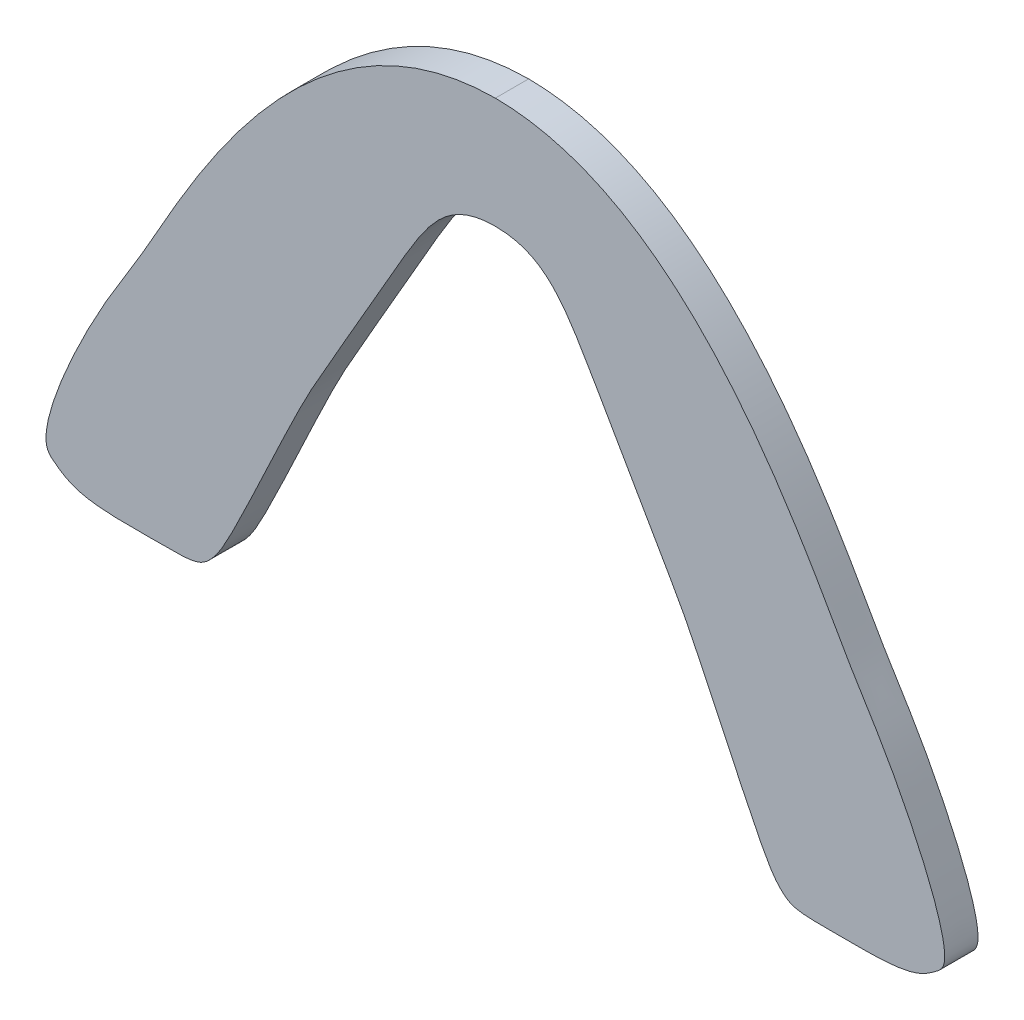
ISO-10303-21;
HEADER;
FILE_DESCRIPTION(('STEP AP214'),'2;1');
FILE_NAME('part.step','',(''),(''),'','','');
FILE_SCHEMA(('AUTOMOTIVE_DESIGN { 1 0 10303 214 1 1 1 1 }'));
ENDSEC;
DATA;
#1=APPLICATION_CONTEXT('core data for automotive mechanical design processes');
#2=APPLICATION_PROTOCOL_DEFINITION('international standard','automotive_design',2000,#1);
#3=PRODUCT_CONTEXT('',#1,'mechanical');
#4=PRODUCT('Part','Part','',(#3));
#5=PRODUCT_RELATED_PRODUCT_CATEGORY('part','',(#4));
#6=PRODUCT_DEFINITION_FORMATION('','',#4);
#7=PRODUCT_DEFINITION_CONTEXT('part definition',#1,'design');
#8=PRODUCT_DEFINITION('design','',#6,#7);
#9=PRODUCT_DEFINITION_SHAPE('','',#8);
#10=(LENGTH_UNIT() NAMED_UNIT(*) SI_UNIT(.MILLI.,.METRE.));
#11=(NAMED_UNIT(*) PLANE_ANGLE_UNIT() SI_UNIT($,.RADIAN.));
#12=(NAMED_UNIT(*) SI_UNIT($,.STERADIAN.) SOLID_ANGLE_UNIT());
#13=UNCERTAINTY_MEASURE_WITH_UNIT(LENGTH_MEASURE(1.E-05),#10,'distance_accuracy_value','');
#14=(GEOMETRIC_REPRESENTATION_CONTEXT(3) GLOBAL_UNCERTAINTY_ASSIGNED_CONTEXT((#13)) GLOBAL_UNIT_ASSIGNED_CONTEXT((#10,
#11,#12)) REPRESENTATION_CONTEXT('',''));
#15=CARTESIAN_POINT('',(0.,0.,0.));
#16=DIRECTION('',(0.,0.,1.));
#17=DIRECTION('',(1.,0.,0.));
#18=AXIS2_PLACEMENT_3D('',#15,#16,#17);
#19=CARTESIAN_POINT('',(0.,30.,3.));
#20=CARTESIAN_POINT('',(-17.1942796454037,29.8874058416594,3.));
#21=CARTESIAN_POINT('',(-29.7257343106107,4.93805107902933,3.));
#22=CARTESIAN_POINT('',(-36.7381908989796,-5.69481323643311,3.));
#23=CARTESIAN_POINT('',(-41.7627249954742,-16.7141084568017,3.));
#24=CARTESIAN_POINT('',(-38.863004845609,-18.8759356772714,3.));
#25=CARTESIAN_POINT('',(-37.4244214350834,-19.856755260774,3.));
#26=CARTESIAN_POINT('',(-27.4189705711391,-19.7967117454138,3.));
#27=CARTESIAN_POINT('',(-26.4894303641271,-19.9390606672589,3.));
#28=CARTESIAN_POINT('',(-23.8176964979451,-16.5294006272602,3.));
#29=CARTESIAN_POINT('',(-18.2793744848231,-3.97143499974837,3.));
#30=CARTESIAN_POINT('',(-15.4138890798223,1.02061960027083,3.));
#31=CARTESIAN_POINT('',(-7.75596279354349,14.4395052448767,3.));
#32=CARTESIAN_POINT('',(-4.38376498207084,20.,3.));
#33=CARTESIAN_POINT('',(0.,20.,3.));
#34=B_SPLINE_CURVE_WITH_KNOTS('',3,(#19,#20,#21,#22,#23,#24,#25,#26,#27,#28,#29,#30,#31,#32,
#33),.UNSPECIFIED.,.F.,.F.,(4,1,1,1,1,1,1,1,1,1,1,1,4),(0.303894497040815,0.38478301417555,
0.404441064065432,0.489804559064722,0.508040858092365,0.56856775531422,0.585333686944483,
0.65893424276473,0.676015716108626,0.739066947039544,0.749871457977586,0.776179421622678,
0.803894497039859),.UNSPECIFIED.);
#35=DIRECTION('',(0.,0.,-1.));
#36=VECTOR('',#35,1.);
#37=SURFACE_OF_LINEAR_EXTRUSION('',#34,#36);
#38=CARTESIAN_POINT('',(0.,30.,0.));
#39=CARTESIAN_POINT('',(-17.1942796454037,29.8874058416594,0.));
#40=CARTESIAN_POINT('',(-29.7257343106107,4.93805107902933,0.));
#41=CARTESIAN_POINT('',(-36.7381908989796,-5.69481323643311,0.));
#42=CARTESIAN_POINT('',(-41.7627249954742,-16.7141084568017,0.));
#43=CARTESIAN_POINT('',(-38.863004845609,-18.8759356772714,0.));
#44=CARTESIAN_POINT('',(-37.4244214350834,-19.856755260774,0.));
#45=CARTESIAN_POINT('',(-27.4189705711391,-19.7967117454138,0.));
#46=CARTESIAN_POINT('',(-26.4894303641271,-19.9390606672589,0.));
#47=CARTESIAN_POINT('',(-23.8176964979451,-16.5294006272602,0.));
#48=CARTESIAN_POINT('',(-18.2793744848231,-3.97143499974837,0.));
#49=CARTESIAN_POINT('',(-15.4138890798223,1.02061960027083,0.));
#50=CARTESIAN_POINT('',(-7.75596279354349,14.4395052448767,0.));
#51=CARTESIAN_POINT('',(-4.38376498207084,20.,0.));
#52=CARTESIAN_POINT('',(0.,20.,0.));
#53=B_SPLINE_CURVE_WITH_KNOTS('',3,(#38,#39,#40,#41,#42,#43,#44,#45,#46,#47,#48,#49,#50,#51,
#52),.UNSPECIFIED.,.F.,.F.,(4,1,1,1,1,1,1,1,1,1,1,1,4),(0.303894497040815,0.38478301417555,
0.404441064065432,0.489804559064722,0.508040858092365,0.56856775531422,0.585333686944483,
0.65893424276473,0.676015716108626,0.739066947039544,0.749871457977586,0.776179421622678,
0.803894497039859),.UNSPECIFIED.);
#54=CARTESIAN_POINT('',(0.,30.,0.));
#55=VERTEX_POINT('',#54);
#56=CARTESIAN_POINT('',(0.,20.,0.));
#57=VERTEX_POINT('',#56);
#58=EDGE_CURVE('E73',#55,#57,#53,.T.);
#59=ORIENTED_EDGE('',*,*,#58,.T.);
#60=DIRECTION('',(0.,0.,-1.));
#61=VECTOR('',#60,1.);
#62=CARTESIAN_POINT('',(0.,20.,3.));
#63=LINE('',#62,#61);
#64=CARTESIAN_POINT('',(0.,20.,3.));
#65=VERTEX_POINT('',#64);
#66=EDGE_CURVE('E11',#65,#57,#63,.T.);
#67=ORIENTED_EDGE('',*,*,#66,.F.);
#68=CARTESIAN_POINT('',(0.,30.,3.));
#69=VERTEX_POINT('',#68);
#70=EDGE_CURVE('E72',#69,#65,#34,.T.);
#71=ORIENTED_EDGE('',*,*,#70,.F.);
#72=DIRECTION('',(0.,0.,-1.));
#73=VECTOR('',#72,1.);
#74=CARTESIAN_POINT('',(0.,30.,3.));
#75=LINE('',#74,#73);
#76=EDGE_CURVE('E49',#69,#55,#75,.T.);
#77=ORIENTED_EDGE('',*,*,#76,.T.);
#78=EDGE_LOOP('',(#59,#67,#71,#77));
#79=FACE_BOUND('',#78,.T.);
#80=ADVANCED_FACE('F39',(#79),#37,.F.);
#81=CARTESIAN_POINT('',(0.,20.,3.));
#82=CARTESIAN_POINT('',(4.38376498207084,20.,3.));
#83=CARTESIAN_POINT('',(7.75596279354348,14.4395052448767,3.));
#84=CARTESIAN_POINT('',(15.4138890798223,1.02061960027083,3.));
#85=CARTESIAN_POINT('',(18.279374484823,-3.97143499974837,3.));
#86=CARTESIAN_POINT('',(23.8176964979451,-16.5294006272602,3.));
#87=CARTESIAN_POINT('',(26.489430364127,-19.9390606672589,3.));
#88=CARTESIAN_POINT('',(27.4189705711391,-19.7967117454138,3.));
#89=CARTESIAN_POINT('',(37.4244214350834,-19.856755260774,3.));
#90=CARTESIAN_POINT('',(38.863004845609,-18.8759356772714,3.));
#91=CARTESIAN_POINT('',(41.7627249954742,-16.7141084568016,3.));
#92=CARTESIAN_POINT('',(36.7381908989797,-5.6948132364331,3.));
#93=CARTESIAN_POINT('',(29.7257343106106,4.93805107902933,3.));
#94=CARTESIAN_POINT('',(17.1942796454037,29.8874058416594,3.));
#95=CARTESIAN_POINT('',(0.,30.,3.));
#96=B_SPLINE_CURVE_WITH_KNOTS('',3,(#81,#82,#83,#84,#85,#86,#87,#88,#89,#90,#91,#92,#93,#94,
#95),.UNSPECIFIED.,.F.,.F.,(4,1,1,1,1,1,1,1,1,1,1,1,4),(0.303894497040815,0.331609572457996,
0.357917536103088,0.36872204704113,0.431773277972048,0.448854751315944,0.522455307136192,
0.539221238766454,0.599748135988309,0.617984435015952,0.703347930015242,0.723005979905124,
0.803894497039859),.UNSPECIFIED.);
#97=DIRECTION('',(0.,0.,-1.));
#98=VECTOR('',#97,1.);
#99=SURFACE_OF_LINEAR_EXTRUSION('',#96,#98);
#100=CARTESIAN_POINT('',(0.,20.,0.));
#101=CARTESIAN_POINT('',(4.38376498207084,20.,0.));
#102=CARTESIAN_POINT('',(7.75596279354348,14.4395052448767,0.));
#103=CARTESIAN_POINT('',(15.4138890798223,1.02061960027083,0.));
#104=CARTESIAN_POINT('',(18.279374484823,-3.97143499974837,0.));
#105=CARTESIAN_POINT('',(23.8176964979451,-16.5294006272602,0.));
#106=CARTESIAN_POINT('',(26.489430364127,-19.9390606672589,0.));
#107=CARTESIAN_POINT('',(27.4189705711391,-19.7967117454138,0.));
#108=CARTESIAN_POINT('',(37.4244214350834,-19.856755260774,0.));
#109=CARTESIAN_POINT('',(38.863004845609,-18.8759356772714,0.));
#110=CARTESIAN_POINT('',(41.7627249954742,-16.7141084568016,0.));
#111=CARTESIAN_POINT('',(36.7381908989797,-5.6948132364331,0.));
#112=CARTESIAN_POINT('',(29.7257343106106,4.93805107902933,0.));
#113=CARTESIAN_POINT('',(17.1942796454037,29.8874058416594,0.));
#114=CARTESIAN_POINT('',(0.,30.,0.));
#115=B_SPLINE_CURVE_WITH_KNOTS('',3,(#100,#101,#102,#103,#104,#105,#106,#107,#108,#109,#110,
#111,#112,#113,#114),.UNSPECIFIED.,.F.,.F.,(4,1,1,1,1,1,1,1,1,1,1,1,4),(0.303894497040815,
0.331609572457996,0.357917536103088,0.36872204704113,0.431773277972048,0.448854751315944,
0.522455307136192,0.539221238766454,0.599748135988309,0.617984435015952,0.703347930015242,
0.723005979905124,0.803894497039859),.UNSPECIFIED.);
#116=EDGE_CURVE('E64',#57,#55,#115,.T.);
#117=ORIENTED_EDGE('',*,*,#116,.T.);
#118=ORIENTED_EDGE('',*,*,#76,.F.);
#119=EDGE_CURVE('E56',#65,#69,#96,.T.);
#120=ORIENTED_EDGE('',*,*,#119,.F.);
#121=ORIENTED_EDGE('',*,*,#66,.T.);
#122=EDGE_LOOP('',(#117,#118,#120,#121));
#123=FACE_BOUND('',#122,.T.);
#124=ADVANCED_FACE('F67',(#123),#99,.F.);
#125=CARTESIAN_POINT('',(-36.373913564302,-19.6323868617764,3.));
#126=DIRECTION('',(0.,0.,-1.));
#127=DIRECTION('',(-1.,0.,0.));
#128=AXIS2_PLACEMENT_3D('',#125,#126,#127);
#129=PLANE('',#128);
#130=ORIENTED_EDGE('',*,*,#70,.T.);
#131=ORIENTED_EDGE('',*,*,#119,.T.);
#132=EDGE_LOOP('',(#130,#131));
#133=FACE_BOUND('',#132,.T.);
#134=ADVANCED_FACE('F103',(#133),#129,.F.);
#135=CARTESIAN_POINT('',(-36.373913564302,-19.6323868617764,0.));
#136=DIRECTION('',(0.,0.,-1.));
#137=DIRECTION('',(-1.,0.,0.));
#138=AXIS2_PLACEMENT_3D('',#135,#136,#137);
#139=PLANE('',#138);
#140=ORIENTED_EDGE('',*,*,#58,.F.);
#141=ORIENTED_EDGE('',*,*,#116,.F.);
#142=EDGE_LOOP('',(#140,#141));
#143=FACE_BOUND('',#142,.T.);
#144=ADVANCED_FACE('F77',(#143),#139,.T.);
#145=CLOSED_SHELL('',(#80,#124,#134,#144));
#146=MANIFOLD_SOLID_BREP('B2',#145);
#147=ADVANCED_BREP_SHAPE_REPRESENTATION('',(#18,#146),#14);
#148=SHAPE_DEFINITION_REPRESENTATION(#9,#147);
ENDSEC;
END-ISO-10303-21;
